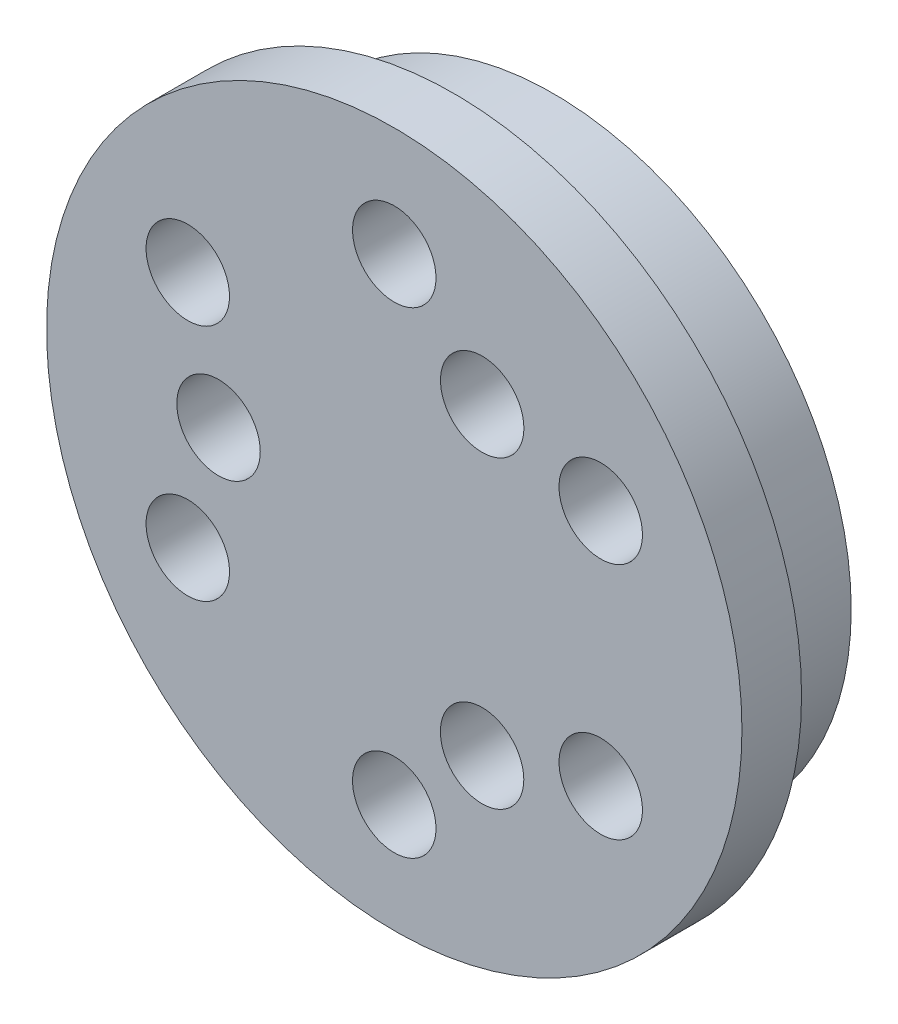
ISO-10303-21;
HEADER;
FILE_DESCRIPTION(('STEP AP214'),'2;1');
FILE_NAME('part.step','',(''),(''),'','','');
FILE_SCHEMA(('AUTOMOTIVE_DESIGN { 1 0 10303 214 1 1 1 1 }'));
ENDSEC;
DATA;
#1=APPLICATION_CONTEXT('core data for automotive mechanical design processes');
#2=APPLICATION_PROTOCOL_DEFINITION('international standard','automotive_design',2000,#1);
#3=PRODUCT_CONTEXT('',#1,'mechanical');
#4=PRODUCT('Part','Part','',(#3));
#5=PRODUCT_RELATED_PRODUCT_CATEGORY('part','',(#4));
#6=PRODUCT_DEFINITION_FORMATION('','',#4);
#7=PRODUCT_DEFINITION_CONTEXT('part definition',#1,'design');
#8=PRODUCT_DEFINITION('design','',#6,#7);
#9=PRODUCT_DEFINITION_SHAPE('','',#8);
#10=(LENGTH_UNIT() NAMED_UNIT(*) SI_UNIT(.MILLI.,.METRE.));
#11=(NAMED_UNIT(*) PLANE_ANGLE_UNIT() SI_UNIT($,.RADIAN.));
#12=(NAMED_UNIT(*) SI_UNIT($,.STERADIAN.) SOLID_ANGLE_UNIT());
#13=UNCERTAINTY_MEASURE_WITH_UNIT(LENGTH_MEASURE(1.E-05),#10,'distance_accuracy_value','');
#14=(GEOMETRIC_REPRESENTATION_CONTEXT(3) GLOBAL_UNCERTAINTY_ASSIGNED_CONTEXT((#13)) GLOBAL_UNIT_ASSIGNED_CONTEXT((#10,
#11,#12)) REPRESENTATION_CONTEXT('',''));
#15=CARTESIAN_POINT('',(0.,0.,0.));
#16=DIRECTION('',(0.,0.,1.));
#17=DIRECTION('',(1.,0.,0.));
#18=AXIS2_PLACEMENT_3D('',#15,#16,#17);
#19=CARTESIAN_POINT('',(0.,0.,7.));
#20=DIRECTION('',(0.,0.,-1.));
#21=DIRECTION('',(-1.,0.,0.));
#22=AXIS2_PLACEMENT_3D('',#19,#20,#21);
#23=CYLINDRICAL_SURFACE('',#22,15.);
#24=CARTESIAN_POINT('',(0.,0.,0.));
#25=DIRECTION('',(0.,0.,1.));
#26=DIRECTION('',(1.,0.,0.));
#27=AXIS2_PLACEMENT_3D('',#24,#25,#26);
#28=CIRCLE('',#27,15.);
#29=CARTESIAN_POINT('',(15.,0.,0.));
#30=VERTEX_POINT('',#29);
#31=EDGE_CURVE('E42',#30,#30,#28,.T.);
#32=ORIENTED_EDGE('',*,*,#31,.T.);
#33=EDGE_LOOP('',(#32));
#34=FACE_BOUND('',#33,.T.);
#35=CARTESIAN_POINT('',(0.,0.,5.));
#36=DIRECTION('',(0.,0.,1.));
#37=DIRECTION('',(1.,0.,0.));
#38=AXIS2_PLACEMENT_3D('',#35,#36,#37);
#39=CIRCLE('',#38,15.);
#40=CARTESIAN_POINT('',(15.,0.,5.));
#41=VERTEX_POINT('',#40);
#42=EDGE_CURVE('E10',#41,#41,#39,.T.);
#43=ORIENTED_EDGE('',*,*,#42,.F.);
#44=EDGE_LOOP('',(#43));
#45=FACE_BOUND('',#44,.T.);
#46=ADVANCED_FACE('F39',(#34,#45),#23,.T.);
#47=CARTESIAN_POINT('',(0.,0.,0.));
#48=DIRECTION('',(0.,0.,1.));
#49=DIRECTION('',(1.,0.,0.));
#50=AXIS2_PLACEMENT_3D('',#47,#48,#49);
#51=PLANE('',#50);
#52=ORIENTED_EDGE('',*,*,#31,.F.);
#53=EDGE_LOOP('',(#52));
#54=FACE_BOUND('',#53,.T.);
#55=CARTESIAN_POINT('',(0.,12.,0.));
#56=DIRECTION('',(0.,0.,1.));
#57=DIRECTION('',(1.,0.,0.));
#58=AXIS2_PLACEMENT_3D('',#55,#56,#57);
#59=CIRCLE('',#58,2.1);
#60=CARTESIAN_POINT('',(2.1,12.,0.));
#61=VERTEX_POINT('',#60);
#62=EDGE_CURVE('E50',#61,#61,#59,.T.);
#63=ORIENTED_EDGE('',*,*,#62,.T.);
#64=EDGE_LOOP('',(#63));
#65=FACE_BOUND('',#64,.T.);
#66=CARTESIAN_POINT('',(10.3923048454133,6.,0.));
#67=DIRECTION('',(0.,0.,1.));
#68=DIRECTION('',(1.,0.,0.));
#69=AXIS2_PLACEMENT_3D('',#66,#67,#68);
#70=CIRCLE('',#69,2.1);
#71=CARTESIAN_POINT('',(12.4923048454133,6.,0.));
#72=VERTEX_POINT('',#71);
#73=EDGE_CURVE('E76',#72,#72,#70,.T.);
#74=ORIENTED_EDGE('',*,*,#73,.T.);
#75=EDGE_LOOP('',(#74));
#76=FACE_BOUND('',#75,.T.);
#77=CARTESIAN_POINT('',(10.3923048454133,-6.,0.));
#78=DIRECTION('',(0.,0.,1.));
#79=DIRECTION('',(1.,0.,0.));
#80=AXIS2_PLACEMENT_3D('',#77,#78,#79);
#81=CIRCLE('',#80,2.1);
#82=CARTESIAN_POINT('',(12.4923048454133,-6.,0.));
#83=VERTEX_POINT('',#82);
#84=EDGE_CURVE('E73',#83,#83,#81,.T.);
#85=ORIENTED_EDGE('',*,*,#84,.T.);
#86=EDGE_LOOP('',(#85));
#87=FACE_BOUND('',#86,.T.);
#88=CARTESIAN_POINT('',(0.,-12.,0.));
#89=DIRECTION('',(0.,0.,1.));
#90=DIRECTION('',(1.,0.,0.));
#91=AXIS2_PLACEMENT_3D('',#88,#89,#90);
#92=CIRCLE('',#91,2.1);
#93=CARTESIAN_POINT('',(2.1,-12.,0.));
#94=VERTEX_POINT('',#93);
#95=EDGE_CURVE('E70',#94,#94,#92,.T.);
#96=ORIENTED_EDGE('',*,*,#95,.T.);
#97=EDGE_LOOP('',(#96));
#98=FACE_BOUND('',#97,.T.);
#99=CARTESIAN_POINT('',(-10.3923048454133,-6.00000000000001,0.));
#100=DIRECTION('',(0.,0.,1.));
#101=DIRECTION('',(1.,0.,0.));
#102=AXIS2_PLACEMENT_3D('',#99,#100,#101);
#103=CIRCLE('',#102,2.1);
#104=CARTESIAN_POINT('',(-8.29230484541326,-6.00000000000001,0.));
#105=VERTEX_POINT('',#104);
#106=EDGE_CURVE('E67',#105,#105,#103,.T.);
#107=ORIENTED_EDGE('',*,*,#106,.T.);
#108=EDGE_LOOP('',(#107));
#109=FACE_BOUND('',#108,.T.);
#110=CARTESIAN_POINT('',(-10.3923048454133,5.99999999999999,0.));
#111=DIRECTION('',(0.,0.,1.));
#112=DIRECTION('',(1.,0.,0.));
#113=AXIS2_PLACEMENT_3D('',#110,#111,#112);
#114=CIRCLE('',#113,2.1);
#115=CARTESIAN_POINT('',(-8.29230484541327,5.99999999999999,0.));
#116=VERTEX_POINT('',#115);
#117=EDGE_CURVE('E64',#116,#116,#114,.T.);
#118=ORIENTED_EDGE('',*,*,#117,.T.);
#119=EDGE_LOOP('',(#118));
#120=FACE_BOUND('',#119,.T.);
#121=CARTESIAN_POINT('',(4.42499999999998,7.66432482349229,0.));
#122=DIRECTION('',(0.,0.,1.));
#123=DIRECTION('',(1.,0.,0.));
#124=AXIS2_PLACEMENT_3D('',#121,#122,#123);
#125=CIRCLE('',#124,2.1);
#126=CARTESIAN_POINT('',(6.52499999999998,7.66432482349229,0.));
#127=VERTEX_POINT('',#126);
#128=EDGE_CURVE('E61',#127,#127,#125,.T.);
#129=ORIENTED_EDGE('',*,*,#128,.T.);
#130=EDGE_LOOP('',(#129));
#131=FACE_BOUND('',#130,.T.);
#132=CARTESIAN_POINT('',(4.41969386639785,-7.65513433050166,0.));
#133=DIRECTION('',(0.,0.,1.));
#134=DIRECTION('',(1.,0.,0.));
#135=AXIS2_PLACEMENT_3D('',#132,#133,#134);
#136=CIRCLE('',#135,2.1);
#137=CARTESIAN_POINT('',(6.51969386639785,-7.65513433050166,0.));
#138=VERTEX_POINT('',#137);
#139=EDGE_CURVE('E58',#138,#138,#136,.T.);
#140=ORIENTED_EDGE('',*,*,#139,.T.);
#141=EDGE_LOOP('',(#140));
#142=FACE_BOUND('',#141,.T.);
#143=CARTESIAN_POINT('',(-8.84469386639791,0.0091904929906383,0.));
#144=DIRECTION('',(0.,0.,1.));
#145=DIRECTION('',(1.,0.,0.));
#146=AXIS2_PLACEMENT_3D('',#143,#144,#145);
#147=CIRCLE('',#146,2.1);
#148=CARTESIAN_POINT('',(-6.74469386639791,0.0091904929906383,0.));
#149=VERTEX_POINT('',#148);
#150=EDGE_CURVE('E55',#149,#149,#147,.T.);
#151=ORIENTED_EDGE('',*,*,#150,.T.);
#152=EDGE_LOOP('',(#151));
#153=FACE_BOUND('',#152,.T.);
#154=ADVANCED_FACE('F81',(#54,#65,#76,#87,#98,#109,#120,#131,#142,#153),#51,.F.);
#155=CARTESIAN_POINT('',(0.,12.,7.));
#156=DIRECTION('',(0.,0.,-1.));
#157=DIRECTION('',(-1.,0.,0.));
#158=AXIS2_PLACEMENT_3D('',#155,#156,#157);
#159=CYLINDRICAL_SURFACE('',#158,2.1);
#160=ORIENTED_EDGE('',*,*,#62,.F.);
#161=EDGE_LOOP('',(#160));
#162=FACE_BOUND('',#161,.T.);
#163=CARTESIAN_POINT('',(0.,12.,8.));
#164=DIRECTION('',(0.,0.,1.));
#165=DIRECTION('',(1.,0.,0.));
#166=AXIS2_PLACEMENT_3D('',#163,#164,#165);
#167=CIRCLE('',#166,2.1);
#168=CARTESIAN_POINT('',(2.1,12.,8.));
#169=VERTEX_POINT('',#168);
#170=EDGE_CURVE('E91',#169,#169,#167,.T.);
#171=ORIENTED_EDGE('',*,*,#170,.T.);
#172=EDGE_LOOP('',(#171));
#173=FACE_BOUND('',#172,.T.);
#174=ADVANCED_FACE('F84',(#162,#173),#159,.F.);
#175=CARTESIAN_POINT('',(10.3923048454133,6.,7.));
#176=DIRECTION('',(0.,0.,-1.));
#177=DIRECTION('',(-1.,0.,0.));
#178=AXIS2_PLACEMENT_3D('',#175,#176,#177);
#179=CYLINDRICAL_SURFACE('',#178,2.1);
#180=ORIENTED_EDGE('',*,*,#73,.F.);
#181=EDGE_LOOP('',(#180));
#182=FACE_BOUND('',#181,.T.);
#183=CARTESIAN_POINT('',(10.3923048454133,6.,8.));
#184=DIRECTION('',(0.,0.,1.));
#185=DIRECTION('',(1.,0.,0.));
#186=AXIS2_PLACEMENT_3D('',#183,#184,#185);
#187=CIRCLE('',#186,2.1);
#188=CARTESIAN_POINT('',(12.4923048454133,6.,8.));
#189=VERTEX_POINT('',#188);
#190=EDGE_CURVE('E97',#189,#189,#187,.T.);
#191=ORIENTED_EDGE('',*,*,#190,.T.);
#192=EDGE_LOOP('',(#191));
#193=FACE_BOUND('',#192,.T.);
#194=ADVANCED_FACE('F87',(#182,#193),#179,.F.);
#195=CARTESIAN_POINT('',(10.3923048454133,-6.,7.));
#196=DIRECTION('',(0.,0.,-1.));
#197=DIRECTION('',(-1.,0.,0.));
#198=AXIS2_PLACEMENT_3D('',#195,#196,#197);
#199=CYLINDRICAL_SURFACE('',#198,2.1);
#200=ORIENTED_EDGE('',*,*,#84,.F.);
#201=EDGE_LOOP('',(#200));
#202=FACE_BOUND('',#201,.T.);
#203=CARTESIAN_POINT('',(10.3923048454133,-6.,8.));
#204=DIRECTION('',(0.,0.,1.));
#205=DIRECTION('',(1.,0.,0.));
#206=AXIS2_PLACEMENT_3D('',#203,#204,#205);
#207=CIRCLE('',#206,2.1);
#208=CARTESIAN_POINT('',(12.4923048454133,-6.,8.));
#209=VERTEX_POINT('',#208);
#210=EDGE_CURVE('E106',#209,#209,#207,.T.);
#211=ORIENTED_EDGE('',*,*,#210,.T.);
#212=EDGE_LOOP('',(#211));
#213=FACE_BOUND('',#212,.T.);
#214=ADVANCED_FACE('F154',(#202,#213),#199,.F.);
#215=CARTESIAN_POINT('',(0.,-12.,7.));
#216=DIRECTION('',(0.,0.,-1.));
#217=DIRECTION('',(-1.,0.,0.));
#218=AXIS2_PLACEMENT_3D('',#215,#216,#217);
#219=CYLINDRICAL_SURFACE('',#218,2.1);
#220=ORIENTED_EDGE('',*,*,#95,.F.);
#221=EDGE_LOOP('',(#220));
#222=FACE_BOUND('',#221,.T.);
#223=CARTESIAN_POINT('',(0.,-12.,8.));
#224=DIRECTION('',(0.,0.,1.));
#225=DIRECTION('',(1.,0.,0.));
#226=AXIS2_PLACEMENT_3D('',#223,#224,#225);
#227=CIRCLE('',#226,2.1);
#228=CARTESIAN_POINT('',(2.1,-12.,8.));
#229=VERTEX_POINT('',#228);
#230=EDGE_CURVE('E112',#229,#229,#227,.T.);
#231=ORIENTED_EDGE('',*,*,#230,.T.);
#232=EDGE_LOOP('',(#231));
#233=FACE_BOUND('',#232,.T.);
#234=ADVANCED_FACE('F158',(#222,#233),#219,.F.);
#235=CARTESIAN_POINT('',(-10.3923048454133,-6.00000000000001,7.));
#236=DIRECTION('',(0.,0.,-1.));
#237=DIRECTION('',(-1.,0.,0.));
#238=AXIS2_PLACEMENT_3D('',#235,#236,#237);
#239=CYLINDRICAL_SURFACE('',#238,2.1);
#240=ORIENTED_EDGE('',*,*,#106,.F.);
#241=EDGE_LOOP('',(#240));
#242=FACE_BOUND('',#241,.T.);
#243=CARTESIAN_POINT('',(-10.3923048454133,-6.00000000000001,8.));
#244=DIRECTION('',(0.,0.,1.));
#245=DIRECTION('',(1.,0.,0.));
#246=AXIS2_PLACEMENT_3D('',#243,#244,#245);
#247=CIRCLE('',#246,2.1);
#248=CARTESIAN_POINT('',(-8.29230484541326,-6.00000000000001,8.));
#249=VERTEX_POINT('',#248);
#250=EDGE_CURVE('E115',#249,#249,#247,.T.);
#251=ORIENTED_EDGE('',*,*,#250,.T.);
#252=EDGE_LOOP('',(#251));
#253=FACE_BOUND('',#252,.T.);
#254=ADVANCED_FACE('F162',(#242,#253),#239,.F.);
#255=CARTESIAN_POINT('',(-10.3923048454133,5.99999999999999,7.));
#256=DIRECTION('',(0.,0.,-1.));
#257=DIRECTION('',(-1.,0.,0.));
#258=AXIS2_PLACEMENT_3D('',#255,#256,#257);
#259=CYLINDRICAL_SURFACE('',#258,2.1);
#260=ORIENTED_EDGE('',*,*,#117,.F.);
#261=EDGE_LOOP('',(#260));
#262=FACE_BOUND('',#261,.T.);
#263=CARTESIAN_POINT('',(-10.3923048454133,5.99999999999999,8.));
#264=DIRECTION('',(0.,0.,1.));
#265=DIRECTION('',(1.,0.,0.));
#266=AXIS2_PLACEMENT_3D('',#263,#264,#265);
#267=CIRCLE('',#266,2.1);
#268=CARTESIAN_POINT('',(-8.29230484541327,5.99999999999999,8.));
#269=VERTEX_POINT('',#268);
#270=EDGE_CURVE('E100',#269,#269,#267,.T.);
#271=ORIENTED_EDGE('',*,*,#270,.T.);
#272=EDGE_LOOP('',(#271));
#273=FACE_BOUND('',#272,.T.);
#274=ADVANCED_FACE('F166',(#262,#273),#259,.F.);
#275=CARTESIAN_POINT('',(4.42499999999998,7.66432482349229,7.));
#276=DIRECTION('',(0.,0.,-1.));
#277=DIRECTION('',(-1.,0.,0.));
#278=AXIS2_PLACEMENT_3D('',#275,#276,#277);
#279=CYLINDRICAL_SURFACE('',#278,2.1);
#280=ORIENTED_EDGE('',*,*,#128,.F.);
#281=EDGE_LOOP('',(#280));
#282=FACE_BOUND('',#281,.T.);
#283=CARTESIAN_POINT('',(4.42499999999998,7.66432482349229,8.));
#284=DIRECTION('',(0.,0.,1.));
#285=DIRECTION('',(1.,0.,0.));
#286=AXIS2_PLACEMENT_3D('',#283,#284,#285);
#287=CIRCLE('',#286,2.1);
#288=CARTESIAN_POINT('',(6.52499999999998,7.66432482349229,8.));
#289=VERTEX_POINT('',#288);
#290=EDGE_CURVE('E93',#289,#289,#287,.T.);
#291=ORIENTED_EDGE('',*,*,#290,.T.);
#292=EDGE_LOOP('',(#291));
#293=FACE_BOUND('',#292,.T.);
#294=ADVANCED_FACE('F170',(#282,#293),#279,.F.);
#295=CARTESIAN_POINT('',(4.41969386639785,-7.65513433050166,7.));
#296=DIRECTION('',(0.,0.,-1.));
#297=DIRECTION('',(-1.,0.,0.));
#298=AXIS2_PLACEMENT_3D('',#295,#296,#297);
#299=CYLINDRICAL_SURFACE('',#298,2.1);
#300=ORIENTED_EDGE('',*,*,#139,.F.);
#301=EDGE_LOOP('',(#300));
#302=FACE_BOUND('',#301,.T.);
#303=CARTESIAN_POINT('',(4.41969386639785,-7.65513433050166,8.));
#304=DIRECTION('',(0.,0.,1.));
#305=DIRECTION('',(1.,0.,0.));
#306=AXIS2_PLACEMENT_3D('',#303,#304,#305);
#307=CIRCLE('',#306,2.1);
#308=CARTESIAN_POINT('',(6.51969386639785,-7.65513433050166,8.));
#309=VERTEX_POINT('',#308);
#310=EDGE_CURVE('E109',#309,#309,#307,.T.);
#311=ORIENTED_EDGE('',*,*,#310,.T.);
#312=EDGE_LOOP('',(#311));
#313=FACE_BOUND('',#312,.T.);
#314=ADVANCED_FACE('F138',(#302,#313),#299,.F.);
#315=CARTESIAN_POINT('',(-8.84469386639791,0.0091904929906383,7.));
#316=DIRECTION('',(0.,0.,-1.));
#317=DIRECTION('',(-1.,0.,0.));
#318=AXIS2_PLACEMENT_3D('',#315,#316,#317);
#319=CYLINDRICAL_SURFACE('',#318,2.1);
#320=ORIENTED_EDGE('',*,*,#150,.F.);
#321=EDGE_LOOP('',(#320));
#322=FACE_BOUND('',#321,.T.);
#323=CARTESIAN_POINT('',(-8.84469386639791,0.0091904929906383,8.));
#324=DIRECTION('',(0.,0.,1.));
#325=DIRECTION('',(1.,0.,0.));
#326=AXIS2_PLACEMENT_3D('',#323,#324,#325);
#327=CIRCLE('',#326,2.1);
#328=CARTESIAN_POINT('',(-6.74469386639791,0.0091904929906383,8.));
#329=VERTEX_POINT('',#328);
#330=EDGE_CURVE('E94',#329,#329,#327,.T.);
#331=ORIENTED_EDGE('',*,*,#330,.T.);
#332=EDGE_LOOP('',(#331));
#333=FACE_BOUND('',#332,.T.);
#334=ADVANCED_FACE('F129',(#322,#333),#319,.F.);
#335=CARTESIAN_POINT('',(0.,0.,5.));
#336=DIRECTION('',(0.,0.,1.));
#337=DIRECTION('',(1.,0.,0.));
#338=AXIS2_PLACEMENT_3D('',#335,#336,#337);
#339=PLANE('',#338);
#340=CARTESIAN_POINT('',(0.,0.,5.));
#341=DIRECTION('',(0.,0.,1.));
#342=DIRECTION('',(1.,0.,0.));
#343=AXIS2_PLACEMENT_3D('',#340,#341,#342);
#344=CIRCLE('',#343,17.5);
#345=CARTESIAN_POINT('',(17.5,0.,5.));
#346=VERTEX_POINT('',#345);
#347=EDGE_CURVE('E53',#346,#346,#344,.T.);
#348=ORIENTED_EDGE('',*,*,#347,.F.);
#349=EDGE_LOOP('',(#348));
#350=FACE_BOUND('',#349,.T.);
#351=ORIENTED_EDGE('',*,*,#42,.T.);
#352=EDGE_LOOP('',(#351));
#353=FACE_BOUND('',#352,.T.);
#354=ADVANCED_FACE('F127',(#350,#353),#339,.F.);
#355=CARTESIAN_POINT('',(0.,0.,5.));
#356=DIRECTION('',(0.,0.,1.));
#357=DIRECTION('',(1.,0.,0.));
#358=AXIS2_PLACEMENT_3D('',#355,#356,#357);
#359=CYLINDRICAL_SURFACE('',#358,17.5);
#360=ORIENTED_EDGE('',*,*,#347,.T.);
#361=EDGE_LOOP('',(#360));
#362=FACE_BOUND('',#361,.T.);
#363=CARTESIAN_POINT('',(0.,0.,8.));
#364=DIRECTION('',(0.,0.,1.));
#365=DIRECTION('',(1.,0.,0.));
#366=AXIS2_PLACEMENT_3D('',#363,#364,#365);
#367=CIRCLE('',#366,17.5);
#368=CARTESIAN_POINT('',(17.5,0.,8.));
#369=VERTEX_POINT('',#368);
#370=EDGE_CURVE('E117',#369,#369,#367,.T.);
#371=ORIENTED_EDGE('',*,*,#370,.F.);
#372=EDGE_LOOP('',(#371));
#373=FACE_BOUND('',#372,.T.);
#374=ADVANCED_FACE('F124',(#362,#373),#359,.T.);
#375=CARTESIAN_POINT('',(0.,0.,8.));
#376=DIRECTION('',(0.,0.,1.));
#377=DIRECTION('',(1.,0.,0.));
#378=AXIS2_PLACEMENT_3D('',#375,#376,#377);
#379=PLANE('',#378);
#380=ORIENTED_EDGE('',*,*,#330,.F.);
#381=EDGE_LOOP('',(#380));
#382=FACE_BOUND('',#381,.T.);
#383=ORIENTED_EDGE('',*,*,#290,.F.);
#384=EDGE_LOOP('',(#383));
#385=FACE_BOUND('',#384,.T.);
#386=ORIENTED_EDGE('',*,*,#210,.F.);
#387=EDGE_LOOP('',(#386));
#388=FACE_BOUND('',#387,.T.);
#389=ORIENTED_EDGE('',*,*,#230,.F.);
#390=EDGE_LOOP('',(#389));
#391=FACE_BOUND('',#390,.T.);
#392=ORIENTED_EDGE('',*,*,#370,.T.);
#393=EDGE_LOOP('',(#392));
#394=FACE_BOUND('',#393,.T.);
#395=ORIENTED_EDGE('',*,*,#250,.F.);
#396=EDGE_LOOP('',(#395));
#397=FACE_BOUND('',#396,.T.);
#398=ORIENTED_EDGE('',*,*,#310,.F.);
#399=EDGE_LOOP('',(#398));
#400=FACE_BOUND('',#399,.T.);
#401=ORIENTED_EDGE('',*,*,#190,.F.);
#402=EDGE_LOOP('',(#401));
#403=FACE_BOUND('',#402,.T.);
#404=ORIENTED_EDGE('',*,*,#170,.F.);
#405=EDGE_LOOP('',(#404));
#406=FACE_BOUND('',#405,.T.);
#407=ORIENTED_EDGE('',*,*,#270,.F.);
#408=EDGE_LOOP('',(#407));
#409=FACE_BOUND('',#408,.T.);
#410=ADVANCED_FACE('F135',(#382,#385,#388,#391,#394,#397,#400,#403,#406,#409),#379,.T.);
#411=CLOSED_SHELL('',(#46,#154,#174,#194,#214,#234,#254,#274,#294,#314,#334,#354,#374,#410));
#412=MANIFOLD_SOLID_BREP('B2',#411);
#413=ADVANCED_BREP_SHAPE_REPRESENTATION('',(#18,#412),#14);
#414=SHAPE_DEFINITION_REPRESENTATION(#9,#413);
ENDSEC;
END-ISO-10303-21;
